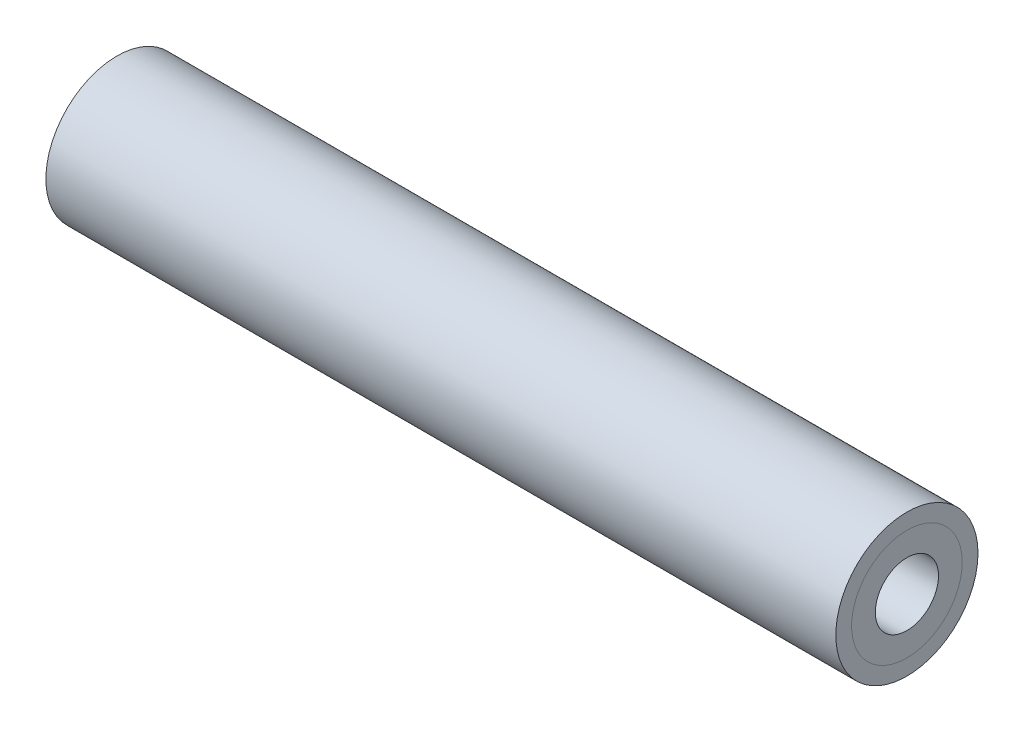
ISO-10303-21;
HEADER;
FILE_DESCRIPTION(('STEP AP214'),'2;1');
FILE_NAME('part.step','',(''),(''),'','','');
FILE_SCHEMA(('AUTOMOTIVE_DESIGN { 1 0 10303 214 1 1 1 1 }'));
ENDSEC;
DATA;
#1=APPLICATION_CONTEXT('core data for automotive mechanical design processes');
#2=APPLICATION_PROTOCOL_DEFINITION('international standard','automotive_design',2000,#1);
#3=PRODUCT_CONTEXT('',#1,'mechanical');
#4=PRODUCT('Part','Part','',(#3));
#5=PRODUCT_RELATED_PRODUCT_CATEGORY('part','',(#4));
#6=PRODUCT_DEFINITION_FORMATION('','',#4);
#7=PRODUCT_DEFINITION_CONTEXT('part definition',#1,'design');
#8=PRODUCT_DEFINITION('design','',#6,#7);
#9=PRODUCT_DEFINITION_SHAPE('','',#8);
#10=(LENGTH_UNIT() NAMED_UNIT(*) SI_UNIT(.MILLI.,.METRE.));
#11=(NAMED_UNIT(*) PLANE_ANGLE_UNIT() SI_UNIT($,.RADIAN.));
#12=(NAMED_UNIT(*) SI_UNIT($,.STERADIAN.) SOLID_ANGLE_UNIT());
#13=UNCERTAINTY_MEASURE_WITH_UNIT(LENGTH_MEASURE(1.E-05),#10,'distance_accuracy_value','');
#14=(GEOMETRIC_REPRESENTATION_CONTEXT(3) GLOBAL_UNCERTAINTY_ASSIGNED_CONTEXT((#13)) GLOBAL_UNIT_ASSIGNED_CONTEXT((#10,
#11,#12)) REPRESENTATION_CONTEXT('',''));
#15=CARTESIAN_POINT('',(0.,0.,0.));
#16=DIRECTION('',(0.,0.,1.));
#17=DIRECTION('',(1.,0.,0.));
#18=AXIS2_PLACEMENT_3D('',#15,#16,#17);
#19=CARTESIAN_POINT('',(-35.,0.,0.));
#20=DIRECTION('',(1.,0.,0.));
#21=DIRECTION('',(0.,0.,-1.));
#22=AXIS2_PLACEMENT_3D('',#19,#20,#21);
#23=PLANE('',#22);
#24=CARTESIAN_POINT('',(-35.,0.,0.));
#25=DIRECTION('',(1.,0.,0.));
#26=DIRECTION('',(0.,0.,-1.));
#27=AXIS2_PLACEMENT_3D('',#24,#25,#26);
#28=CIRCLE('',#27,7.);
#29=CARTESIAN_POINT('',(-35.,0.,-7.));
#30=VERTEX_POINT('',#29);
#31=EDGE_CURVE('E11',#30,#30,#28,.T.);
#32=ORIENTED_EDGE('',*,*,#31,.T.);
#33=EDGE_LOOP('',(#32));
#34=FACE_BOUND('',#33,.T.);
#35=CARTESIAN_POINT('',(-35.,0.,0.));
#36=DIRECTION('',(1.,0.,0.));
#37=DIRECTION('',(0.,0.,-1.));
#38=AXIS2_PLACEMENT_3D('',#35,#36,#37);
#39=CIRCLE('',#38,4.);
#40=CARTESIAN_POINT('',(-35.,0.,-4.));
#41=VERTEX_POINT('',#40);
#42=EDGE_CURVE('E51',#41,#41,#39,.T.);
#43=ORIENTED_EDGE('',*,*,#42,.F.);
#44=EDGE_LOOP('',(#43));
#45=FACE_BOUND('',#44,.T.);
#46=ADVANCED_FACE('F40',(#34,#45),#23,.T.);
#47=CARTESIAN_POINT('',(-50.,0.,0.));
#48=DIRECTION('',(1.,0.,0.));
#49=DIRECTION('',(0.,0.,-1.));
#50=AXIS2_PLACEMENT_3D('',#47,#48,#49);
#51=PLANE('',#50);
#52=CARTESIAN_POINT('',(-50.,0.,0.));
#53=DIRECTION('',(1.,0.,0.));
#54=DIRECTION('',(0.,0.,-1.));
#55=AXIS2_PLACEMENT_3D('',#52,#53,#54);
#56=CIRCLE('',#55,7.);
#57=CARTESIAN_POINT('',(-50.,0.,-7.));
#58=VERTEX_POINT('',#57);
#59=EDGE_CURVE('E44',#58,#58,#56,.T.);
#60=ORIENTED_EDGE('',*,*,#59,.F.);
#61=EDGE_LOOP('',(#60));
#62=FACE_BOUND('',#61,.T.);
#63=CARTESIAN_POINT('',(-50.,0.,0.));
#64=DIRECTION('',(1.,0.,0.));
#65=DIRECTION('',(0.,0.,-1.));
#66=AXIS2_PLACEMENT_3D('',#63,#64,#65);
#67=CIRCLE('',#66,4.);
#68=CARTESIAN_POINT('',(-50.,0.,-4.));
#69=VERTEX_POINT('',#68);
#70=EDGE_CURVE('E53',#69,#69,#67,.T.);
#71=ORIENTED_EDGE('',*,*,#70,.T.);
#72=EDGE_LOOP('',(#71));
#73=FACE_BOUND('',#72,.T.);
#74=ADVANCED_FACE('F63',(#62,#73),#51,.F.);
#75=CARTESIAN_POINT('',(-35.,0.,0.));
#76=DIRECTION('',(-1.,0.,0.));
#77=DIRECTION('',(0.,0.,1.));
#78=AXIS2_PLACEMENT_3D('',#75,#76,#77);
#79=CYLINDRICAL_SURFACE('',#78,7.);
#80=ORIENTED_EDGE('',*,*,#31,.F.);
#81=EDGE_LOOP('',(#80));
#82=FACE_BOUND('',#81,.T.);
#83=ORIENTED_EDGE('',*,*,#59,.T.);
#84=EDGE_LOOP('',(#83));
#85=FACE_BOUND('',#84,.T.);
#86=ADVANCED_FACE('F42',(#82,#85),#79,.T.);
#87=CARTESIAN_POINT('',(-35.,0.,0.));
#88=DIRECTION('',(-1.,0.,0.));
#89=DIRECTION('',(0.,0.,1.));
#90=AXIS2_PLACEMENT_3D('',#87,#88,#89);
#91=CYLINDRICAL_SURFACE('',#90,4.);
#92=ORIENTED_EDGE('',*,*,#42,.T.);
#93=EDGE_LOOP('',(#92));
#94=FACE_BOUND('',#93,.T.);
#95=ORIENTED_EDGE('',*,*,#70,.F.);
#96=EDGE_LOOP('',(#95));
#97=FACE_BOUND('',#96,.T.);
#98=ADVANCED_FACE('F59',(#94,#97),#91,.F.);
#99=CLOSED_SHELL('',(#46,#74,#86,#98));
#100=MANIFOLD_SOLID_BREP('B2',#99);
#101=CARTESIAN_POINT('',(35.,0.,0.));
#102=DIRECTION('',(1.,0.,0.));
#103=DIRECTION('',(0.,0.,-1.));
#104=AXIS2_PLACEMENT_3D('',#101,#102,#103);
#105=CYLINDRICAL_SURFACE('',#104,7.);
#106=CARTESIAN_POINT('',(35.,0.,0.));
#107=DIRECTION('',(1.,0.,0.));
#108=DIRECTION('',(0.,0.,-1.));
#109=AXIS2_PLACEMENT_3D('',#106,#107,#108);
#110=CIRCLE('',#109,7.);
#111=CARTESIAN_POINT('',(35.,0.,-7.));
#112=VERTEX_POINT('',#111);
#113=EDGE_CURVE('E39',#112,#112,#110,.T.);
#114=ORIENTED_EDGE('',*,*,#113,.T.);
#115=EDGE_LOOP('',(#114));
#116=FACE_BOUND('',#115,.T.);
#117=CARTESIAN_POINT('',(50.,0.,0.));
#118=DIRECTION('',(1.,0.,0.));
#119=DIRECTION('',(0.,0.,-1.));
#120=AXIS2_PLACEMENT_3D('',#117,#118,#119);
#121=CIRCLE('',#120,7.);
#122=CARTESIAN_POINT('',(50.,0.,-7.));
#123=VERTEX_POINT('',#122);
#124=EDGE_CURVE('E112',#123,#123,#121,.T.);
#125=ORIENTED_EDGE('',*,*,#124,.F.);
#126=EDGE_LOOP('',(#125));
#127=FACE_BOUND('',#126,.T.);
#128=ADVANCED_FACE('F109',(#116,#127),#105,.T.);
#129=CARTESIAN_POINT('',(35.,0.,0.));
#130=DIRECTION('',(1.,0.,0.));
#131=DIRECTION('',(0.,0.,-1.));
#132=AXIS2_PLACEMENT_3D('',#129,#130,#131);
#133=PLANE('',#132);
#134=CARTESIAN_POINT('',(35.,0.,0.));
#135=DIRECTION('',(1.,0.,0.));
#136=DIRECTION('',(0.,0.,-1.));
#137=AXIS2_PLACEMENT_3D('',#134,#135,#136);
#138=CIRCLE('',#137,4.);
#139=CARTESIAN_POINT('',(35.,0.,-4.));
#140=VERTEX_POINT('',#139);
#141=EDGE_CURVE('E119',#140,#140,#138,.T.);
#142=ORIENTED_EDGE('',*,*,#141,.T.);
#143=EDGE_LOOP('',(#142));
#144=FACE_BOUND('',#143,.T.);
#145=ORIENTED_EDGE('',*,*,#113,.F.);
#146=EDGE_LOOP('',(#145));
#147=FACE_BOUND('',#146,.T.);
#148=ADVANCED_FACE('F127',(#144,#147),#133,.F.);
#149=CARTESIAN_POINT('',(50.,0.,0.));
#150=DIRECTION('',(1.,0.,0.));
#151=DIRECTION('',(0.,0.,-1.));
#152=AXIS2_PLACEMENT_3D('',#149,#150,#151);
#153=PLANE('',#152);
#154=CARTESIAN_POINT('',(50.,0.,0.));
#155=DIRECTION('',(1.,0.,0.));
#156=DIRECTION('',(0.,0.,-1.));
#157=AXIS2_PLACEMENT_3D('',#154,#155,#156);
#158=CIRCLE('',#157,4.);
#159=CARTESIAN_POINT('',(50.,0.,-4.));
#160=VERTEX_POINT('',#159);
#161=EDGE_CURVE('E121',#160,#160,#158,.T.);
#162=ORIENTED_EDGE('',*,*,#161,.F.);
#163=EDGE_LOOP('',(#162));
#164=FACE_BOUND('',#163,.T.);
#165=ORIENTED_EDGE('',*,*,#124,.T.);
#166=EDGE_LOOP('',(#165));
#167=FACE_BOUND('',#166,.T.);
#168=ADVANCED_FACE('F133',(#164,#167),#153,.T.);
#169=CARTESIAN_POINT('',(35.,0.,0.));
#170=DIRECTION('',(1.,0.,0.));
#171=DIRECTION('',(0.,0.,-1.));
#172=AXIS2_PLACEMENT_3D('',#169,#170,#171);
#173=CYLINDRICAL_SURFACE('',#172,4.);
#174=ORIENTED_EDGE('',*,*,#141,.F.);
#175=EDGE_LOOP('',(#174));
#176=FACE_BOUND('',#175,.T.);
#177=ORIENTED_EDGE('',*,*,#161,.T.);
#178=EDGE_LOOP('',(#177));
#179=FACE_BOUND('',#178,.T.);
#180=ADVANCED_FACE('F130',(#176,#179),#173,.F.);
#181=CLOSED_SHELL('',(#128,#148,#168,#180));
#182=MANIFOLD_SOLID_BREP('B6',#181);
#183=CARTESIAN_POINT('',(50.,0.,0.));
#184=DIRECTION('',(1.,0.,0.));
#185=DIRECTION('',(0.,0.,-1.));
#186=AXIS2_PLACEMENT_3D('',#183,#184,#185);
#187=PLANE('',#186);
#188=CARTESIAN_POINT('',(50.,0.,0.));
#189=DIRECTION('',(1.,0.,0.));
#190=DIRECTION('',(0.,0.,-1.));
#191=AXIS2_PLACEMENT_3D('',#188,#189,#190);
#192=CIRCLE('',#191,9.);
#193=CARTESIAN_POINT('',(50.,0.,-9.));
#194=VERTEX_POINT('',#193);
#195=EDGE_CURVE('E108',#194,#194,#192,.T.);
#196=ORIENTED_EDGE('',*,*,#195,.T.);
#197=EDGE_LOOP('',(#196));
#198=FACE_BOUND('',#197,.T.);
#199=CARTESIAN_POINT('',(50.,0.,0.));
#200=DIRECTION('',(1.,0.,0.));
#201=DIRECTION('',(0.,0.,-1.));
#202=AXIS2_PLACEMENT_3D('',#199,#200,#201);
#203=CIRCLE('',#202,7.);
#204=CARTESIAN_POINT('',(50.,0.,-7.));
#205=VERTEX_POINT('',#204);
#206=EDGE_CURVE('E182',#205,#205,#203,.T.);
#207=ORIENTED_EDGE('',*,*,#206,.F.);
#208=EDGE_LOOP('',(#207));
#209=FACE_BOUND('',#208,.T.);
#210=ADVANCED_FACE('F171',(#198,#209),#187,.T.);
#211=CARTESIAN_POINT('',(-50.,0.,0.));
#212=DIRECTION('',(1.,0.,0.));
#213=DIRECTION('',(0.,0.,-1.));
#214=AXIS2_PLACEMENT_3D('',#211,#212,#213);
#215=PLANE('',#214);
#216=CARTESIAN_POINT('',(-50.,0.,0.));
#217=DIRECTION('',(1.,0.,0.));
#218=DIRECTION('',(0.,0.,-1.));
#219=AXIS2_PLACEMENT_3D('',#216,#217,#218);
#220=CIRCLE('',#219,9.);
#221=CARTESIAN_POINT('',(-50.,0.,-9.));
#222=VERTEX_POINT('',#221);
#223=EDGE_CURVE('E175',#222,#222,#220,.T.);
#224=ORIENTED_EDGE('',*,*,#223,.F.);
#225=EDGE_LOOP('',(#224));
#226=FACE_BOUND('',#225,.T.);
#227=CARTESIAN_POINT('',(-50.,0.,0.));
#228=DIRECTION('',(1.,0.,0.));
#229=DIRECTION('',(0.,0.,-1.));
#230=AXIS2_PLACEMENT_3D('',#227,#228,#229);
#231=CIRCLE('',#230,7.);
#232=CARTESIAN_POINT('',(-50.,0.,-7.));
#233=VERTEX_POINT('',#232);
#234=EDGE_CURVE('E184',#233,#233,#231,.T.);
#235=ORIENTED_EDGE('',*,*,#234,.T.);
#236=EDGE_LOOP('',(#235));
#237=FACE_BOUND('',#236,.T.);
#238=ADVANCED_FACE('F194',(#226,#237),#215,.F.);
#239=CARTESIAN_POINT('',(50.,0.,0.));
#240=DIRECTION('',(-1.,0.,0.));
#241=DIRECTION('',(0.,0.,1.));
#242=AXIS2_PLACEMENT_3D('',#239,#240,#241);
#243=CYLINDRICAL_SURFACE('',#242,9.);
#244=ORIENTED_EDGE('',*,*,#195,.F.);
#245=EDGE_LOOP('',(#244));
#246=FACE_BOUND('',#245,.T.);
#247=ORIENTED_EDGE('',*,*,#223,.T.);
#248=EDGE_LOOP('',(#247));
#249=FACE_BOUND('',#248,.T.);
#250=ADVANCED_FACE('F173',(#246,#249),#243,.T.);
#251=CARTESIAN_POINT('',(50.,0.,0.));
#252=DIRECTION('',(-1.,0.,0.));
#253=DIRECTION('',(0.,0.,1.));
#254=AXIS2_PLACEMENT_3D('',#251,#252,#253);
#255=CYLINDRICAL_SURFACE('',#254,7.);
#256=ORIENTED_EDGE('',*,*,#206,.T.);
#257=EDGE_LOOP('',(#256));
#258=FACE_BOUND('',#257,.T.);
#259=ORIENTED_EDGE('',*,*,#234,.F.);
#260=EDGE_LOOP('',(#259));
#261=FACE_BOUND('',#260,.T.);
#262=ADVANCED_FACE('F190',(#258,#261),#255,.F.);
#263=CLOSED_SHELL('',(#210,#238,#250,#262));
#264=MANIFOLD_SOLID_BREP('B34',#263);
#265=ADVANCED_BREP_SHAPE_REPRESENTATION('',(#18,#100,#182,#264),#14);
#266=SHAPE_DEFINITION_REPRESENTATION(#9,#265);
ENDSEC;
END-ISO-10303-21;
